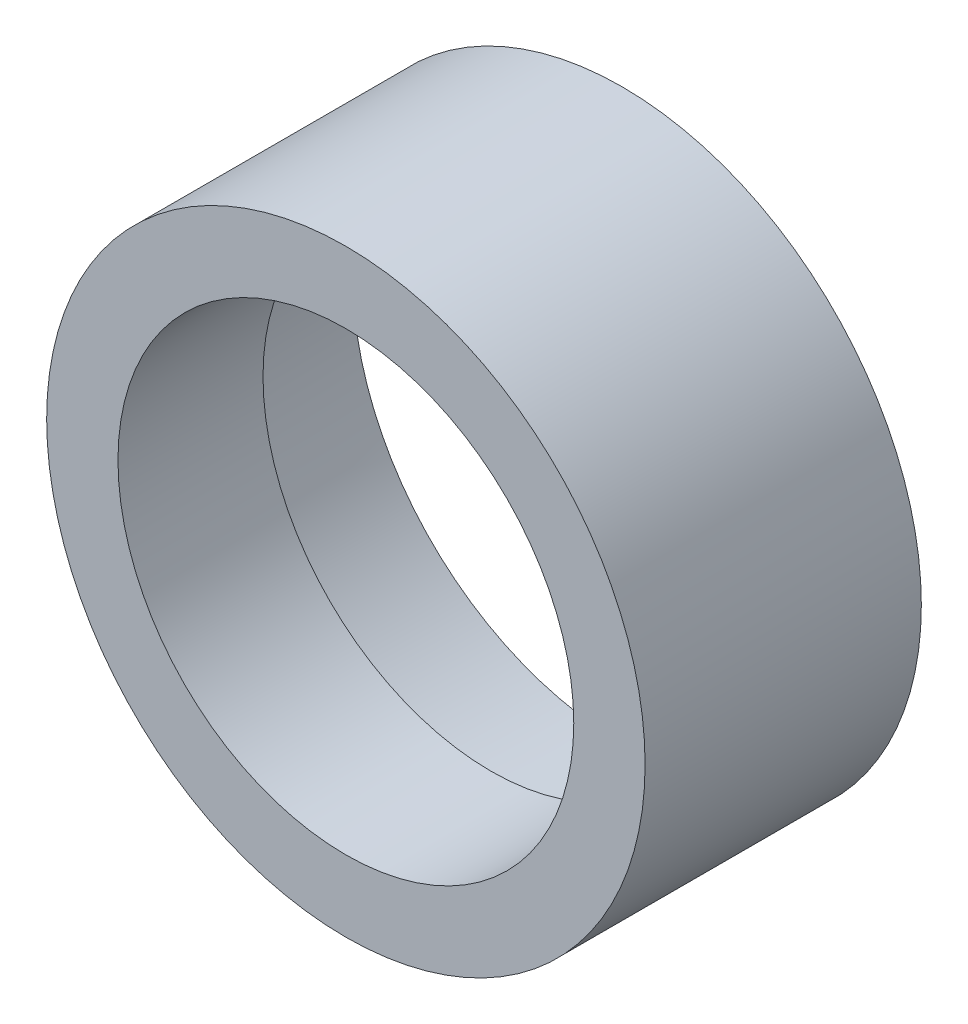
ISO-10303-21;
HEADER;
FILE_DESCRIPTION(('STEP AP214'),'2;1');
FILE_NAME('part.step','',(''),(''),'','','');
FILE_SCHEMA(('AUTOMOTIVE_DESIGN { 1 0 10303 214 1 1 1 1 }'));
ENDSEC;
DATA;
#1=APPLICATION_CONTEXT('core data for automotive mechanical design processes');
#2=APPLICATION_PROTOCOL_DEFINITION('international standard','automotive_design',2000,#1);
#3=PRODUCT_CONTEXT('',#1,'mechanical');
#4=PRODUCT('Part','Part','',(#3));
#5=PRODUCT_RELATED_PRODUCT_CATEGORY('part','',(#4));
#6=PRODUCT_DEFINITION_FORMATION('','',#4);
#7=PRODUCT_DEFINITION_CONTEXT('part definition',#1,'design');
#8=PRODUCT_DEFINITION('design','',#6,#7);
#9=PRODUCT_DEFINITION_SHAPE('','',#8);
#10=(LENGTH_UNIT() NAMED_UNIT(*) SI_UNIT(.MILLI.,.METRE.));
#11=(NAMED_UNIT(*) PLANE_ANGLE_UNIT() SI_UNIT($,.RADIAN.));
#12=(NAMED_UNIT(*) SI_UNIT($,.STERADIAN.) SOLID_ANGLE_UNIT());
#13=UNCERTAINTY_MEASURE_WITH_UNIT(LENGTH_MEASURE(1.E-05),#10,'distance_accuracy_value','');
#14=(GEOMETRIC_REPRESENTATION_CONTEXT(3) GLOBAL_UNCERTAINTY_ASSIGNED_CONTEXT((#13)) GLOBAL_UNIT_ASSIGNED_CONTEXT((#10,
#11,#12)) REPRESENTATION_CONTEXT('',''));
#15=CARTESIAN_POINT('',(0.,0.,0.));
#16=DIRECTION('',(0.,0.,1.));
#17=DIRECTION('',(1.,0.,0.));
#18=AXIS2_PLACEMENT_3D('',#15,#16,#17);
#19=CARTESIAN_POINT('',(-21.6632952847611,0.,0.));
#20=DIRECTION('',(0.,0.,1.));
#21=DIRECTION('',(1.,0.,0.));
#22=AXIS2_PLACEMENT_3D('',#19,#20,#21);
#23=PLANE('',#22);
#24=CARTESIAN_POINT('',(0.,0.,0.));
#25=DIRECTION('',(0.,0.,1.));
#26=DIRECTION('',(1.,0.,0.));
#27=AXIS2_PLACEMENT_3D('',#24,#25,#26);
#28=CIRCLE('',#27,21.6632952847611);
#29=CARTESIAN_POINT('',(21.6632952847611,0.,0.));
#30=VERTEX_POINT('',#29);
#31=EDGE_CURVE('E59',#30,#30,#28,.T.);
#32=ORIENTED_EDGE('',*,*,#31,.F.);
#33=EDGE_LOOP('',(#32));
#34=FACE_BOUND('',#33,.T.);
#35=CARTESIAN_POINT('',(0.,0.,0.));
#36=DIRECTION('',(0.,0.,1.));
#37=DIRECTION('',(1.,0.,0.));
#38=AXIS2_PLACEMENT_3D('',#35,#36,#37);
#39=CIRCLE('',#38,19.5);
#40=CARTESIAN_POINT('',(19.5,0.,0.));
#41=VERTEX_POINT('',#40);
#42=EDGE_CURVE('E10',#41,#41,#39,.T.);
#43=ORIENTED_EDGE('',*,*,#42,.T.);
#44=EDGE_LOOP('',(#43));
#45=FACE_BOUND('',#44,.T.);
#46=ADVANCED_FACE('F37',(#34,#45),#23,.F.);
#47=CARTESIAN_POINT('',(0.,0.,8.));
#48=DIRECTION('',(0.,0.,-1.));
#49=DIRECTION('',(-1.,0.,0.));
#50=AXIS2_PLACEMENT_3D('',#47,#48,#49);
#51=CONICAL_SURFACE('',#50,19.25,0.0312398334302679);
#52=ORIENTED_EDGE('',*,*,#42,.F.);
#53=EDGE_LOOP('',(#52));
#54=FACE_BOUND('',#53,.T.);
#55=CARTESIAN_POINT('',(0.,0.,8.));
#56=DIRECTION('',(0.,0.,1.));
#57=DIRECTION('',(1.,0.,0.));
#58=AXIS2_PLACEMENT_3D('',#55,#56,#57);
#59=CIRCLE('',#58,19.25);
#60=CARTESIAN_POINT('',(19.25,0.,8.));
#61=VERTEX_POINT('',#60);
#62=EDGE_CURVE('E43',#61,#61,#59,.T.);
#63=ORIENTED_EDGE('',*,*,#62,.T.);
#64=EDGE_LOOP('',(#63));
#65=FACE_BOUND('',#64,.T.);
#66=ADVANCED_FACE('F66',(#54,#65),#51,.F.);
#67=CARTESIAN_POINT('',(0.,0.,9.5));
#68=DIRECTION('',(0.,0.,-1.));
#69=DIRECTION('',(-1.,0.,0.));
#70=AXIS2_PLACEMENT_3D('',#67,#68,#69);
#71=CONICAL_SURFACE('',#70,16.5,1.07144960511477);
#72=ORIENTED_EDGE('',*,*,#62,.F.);
#73=EDGE_LOOP('',(#72));
#74=FACE_BOUND('',#73,.T.);
#75=CARTESIAN_POINT('',(0.,0.,9.5));
#76=DIRECTION('',(0.,0.,1.));
#77=DIRECTION('',(1.,0.,0.));
#78=AXIS2_PLACEMENT_3D('',#75,#76,#77);
#79=CIRCLE('',#78,16.5);
#80=CARTESIAN_POINT('',(16.5,0.,9.5));
#81=VERTEX_POINT('',#80);
#82=EDGE_CURVE('E47',#81,#81,#79,.T.);
#83=ORIENTED_EDGE('',*,*,#82,.T.);
#84=EDGE_LOOP('',(#83));
#85=FACE_BOUND('',#84,.T.);
#86=ADVANCED_FACE('F70',(#74,#85),#71,.F.);
#87=CARTESIAN_POINT('',(0.,0.,20.));
#88=DIRECTION('',(0.,0.,1.));
#89=DIRECTION('',(1.,0.,0.));
#90=AXIS2_PLACEMENT_3D('',#87,#88,#89);
#91=CYLINDRICAL_SURFACE('',#90,16.5);
#92=ORIENTED_EDGE('',*,*,#82,.F.);
#93=EDGE_LOOP('',(#92));
#94=FACE_BOUND('',#93,.T.);
#95=CARTESIAN_POINT('',(0.,0.,20.));
#96=DIRECTION('',(0.,0.,1.));
#97=DIRECTION('',(1.,0.,0.));
#98=AXIS2_PLACEMENT_3D('',#95,#96,#97);
#99=CIRCLE('',#98,16.5);
#100=CARTESIAN_POINT('',(16.5,0.,20.));
#101=VERTEX_POINT('',#100);
#102=EDGE_CURVE('E51',#101,#101,#99,.T.);
#103=ORIENTED_EDGE('',*,*,#102,.T.);
#104=EDGE_LOOP('',(#103));
#105=FACE_BOUND('',#104,.T.);
#106=ADVANCED_FACE('F75',(#94,#105),#91,.F.);
#107=CARTESIAN_POINT('',(-16.5,0.,20.));
#108=DIRECTION('',(0.,0.,-1.));
#109=DIRECTION('',(-1.,0.,0.));
#110=AXIS2_PLACEMENT_3D('',#107,#108,#109);
#111=PLANE('',#110);
#112=ORIENTED_EDGE('',*,*,#102,.F.);
#113=EDGE_LOOP('',(#112));
#114=FACE_BOUND('',#113,.T.);
#115=CARTESIAN_POINT('',(0.,0.,20.));
#116=DIRECTION('',(0.,0.,1.));
#117=DIRECTION('',(1.,0.,0.));
#118=AXIS2_PLACEMENT_3D('',#115,#116,#117);
#119=CIRCLE('',#118,21.6632952847611);
#120=CARTESIAN_POINT('',(21.6632952847611,0.,20.));
#121=VERTEX_POINT('',#120);
#122=EDGE_CURVE('E56',#121,#121,#119,.T.);
#123=ORIENTED_EDGE('',*,*,#122,.T.);
#124=EDGE_LOOP('',(#123));
#125=FACE_BOUND('',#124,.T.);
#126=ADVANCED_FACE('F81',(#114,#125),#111,.F.);
#127=CARTESIAN_POINT('',(0.,0.,20.));
#128=DIRECTION('',(0.,0.,1.));
#129=DIRECTION('',(1.,0.,0.));
#130=AXIS2_PLACEMENT_3D('',#127,#128,#129);
#131=CYLINDRICAL_SURFACE('',#130,21.6632952847611);
#132=ORIENTED_EDGE('',*,*,#122,.F.);
#133=EDGE_LOOP('',(#132));
#134=FACE_BOUND('',#133,.T.);
#135=ORIENTED_EDGE('',*,*,#31,.T.);
#136=EDGE_LOOP('',(#135));
#137=FACE_BOUND('',#136,.T.);
#138=ADVANCED_FACE('F63',(#134,#137),#131,.T.);
#139=CLOSED_SHELL('',(#46,#66,#86,#106,#126,#138));
#140=MANIFOLD_SOLID_BREP('B2',#139);
#141=ADVANCED_BREP_SHAPE_REPRESENTATION('',(#18,#140),#14);
#142=SHAPE_DEFINITION_REPRESENTATION(#9,#141);
ENDSEC;
END-ISO-10303-21;
